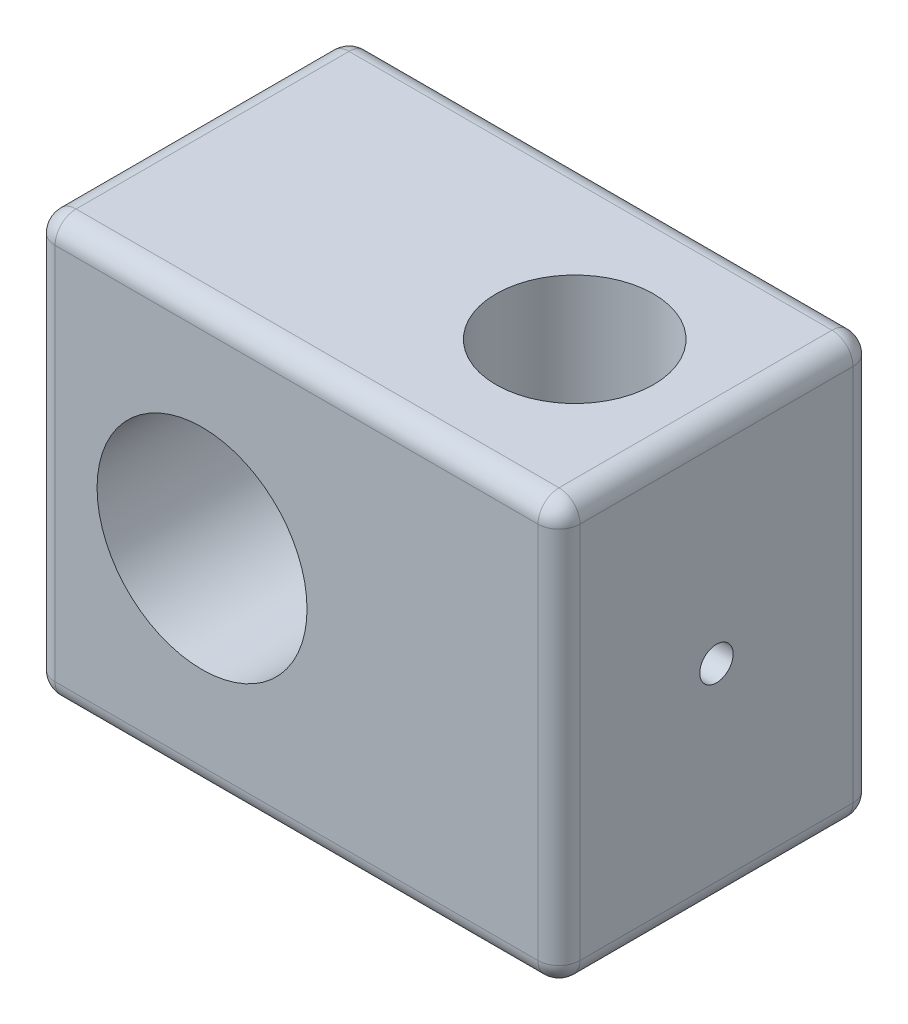
ISO-10303-21;
HEADER;
FILE_DESCRIPTION(('STEP AP214'),'2;1');
FILE_NAME('part.step','',(''),(''),'','','');
FILE_SCHEMA(('AUTOMOTIVE_DESIGN { 1 0 10303 214 1 1 1 1 }'));
ENDSEC;
DATA;
#1=APPLICATION_CONTEXT('core data for automotive mechanical design processes');
#2=APPLICATION_PROTOCOL_DEFINITION('international standard','automotive_design',2000,#1);
#3=PRODUCT_CONTEXT('',#1,'mechanical');
#4=PRODUCT('Part','Part','',(#3));
#5=PRODUCT_RELATED_PRODUCT_CATEGORY('part','',(#4));
#6=PRODUCT_DEFINITION_FORMATION('','',#4);
#7=PRODUCT_DEFINITION_CONTEXT('part definition',#1,'design');
#8=PRODUCT_DEFINITION('design','',#6,#7);
#9=PRODUCT_DEFINITION_SHAPE('','',#8);
#10=(LENGTH_UNIT() NAMED_UNIT(*) SI_UNIT(.MILLI.,.METRE.));
#11=(NAMED_UNIT(*) PLANE_ANGLE_UNIT() SI_UNIT($,.RADIAN.));
#12=(NAMED_UNIT(*) SI_UNIT($,.STERADIAN.) SOLID_ANGLE_UNIT());
#13=UNCERTAINTY_MEASURE_WITH_UNIT(LENGTH_MEASURE(1.E-05),#10,'distance_accuracy_value','');
#14=(GEOMETRIC_REPRESENTATION_CONTEXT(3) GLOBAL_UNCERTAINTY_ASSIGNED_CONTEXT((#13)) GLOBAL_UNIT_ASSIGNED_CONTEXT((#10,
#11,#12)) REPRESENTATION_CONTEXT('',''));
#15=CARTESIAN_POINT('',(0.,0.,0.));
#16=DIRECTION('',(0.,0.,1.));
#17=DIRECTION('',(1.,0.,0.));
#18=AXIS2_PLACEMENT_3D('',#15,#16,#17);
#19=CARTESIAN_POINT('',(31.75,50.8,-19.05));
#20=DIRECTION('',(-1.,0.,0.));
#21=DIRECTION('',(0.,0.,1.));
#22=AXIS2_PLACEMENT_3D('',#19,#20,#21);
#23=PLANE('',#22);
#24=CARTESIAN_POINT('',(31.75,25.4,0.));
#25=DIRECTION('',(1.,0.,0.));
#26=DIRECTION('',(0.,0.,-1.));
#27=AXIS2_PLACEMENT_3D('',#24,#25,#26);
#28=CIRCLE('',#27,2.0193);
#29=CARTESIAN_POINT('',(31.75,25.4,-2.0193));
#30=VERTEX_POINT('',#29);
#31=EDGE_CURVE('E277',#30,#30,#28,.T.);
#32=ORIENTED_EDGE('',*,*,#31,.F.);
#33=EDGE_LOOP('',(#32));
#34=FACE_BOUND('',#33,.T.);
#35=DIRECTION('',(0.,-1.,0.));
#36=VECTOR('',#35,1.);
#37=CARTESIAN_POINT('',(31.75,50.8,16.51));
#38=LINE('',#37,#36);
#39=CARTESIAN_POINT('',(31.75,48.26,16.51));
#40=VERTEX_POINT('',#39);
#41=CARTESIAN_POINT('',(31.75,2.54,16.51));
#42=VERTEX_POINT('',#41);
#43=EDGE_CURVE('E61',#40,#42,#38,.T.);
#44=ORIENTED_EDGE('',*,*,#43,.T.);
#45=DIRECTION('',(0.,0.,-1.));
#46=VECTOR('',#45,1.);
#47=CARTESIAN_POINT('',(31.75,2.54,-19.05));
#48=LINE('',#47,#46);
#49=CARTESIAN_POINT('',(31.75,2.54,-16.51));
#50=VERTEX_POINT('',#49);
#51=EDGE_CURVE('E11',#42,#50,#48,.T.);
#52=ORIENTED_EDGE('',*,*,#51,.T.);
#53=DIRECTION('',(0.,-1.,0.));
#54=VECTOR('',#53,1.);
#55=CARTESIAN_POINT('',(31.75,50.8,-16.51));
#56=LINE('',#55,#54);
#57=CARTESIAN_POINT('',(31.75,48.26,-16.51));
#58=VERTEX_POINT('',#57);
#59=EDGE_CURVE('E50',#50,#58,#56,.F.);
#60=ORIENTED_EDGE('',*,*,#59,.T.);
#61=DIRECTION('',(0.,0.,-1.));
#62=VECTOR('',#61,1.);
#63=CARTESIAN_POINT('',(31.75,48.26,19.05));
#64=LINE('',#63,#62);
#65=EDGE_CURVE('E212',#58,#40,#64,.F.);
#66=ORIENTED_EDGE('',*,*,#65,.T.);
#67=EDGE_LOOP('',(#44,#52,#60,#66));
#68=FACE_BOUND('',#67,.T.);
#69=ADVANCED_FACE('F36',(#34,#68),#23,.F.);
#70=CARTESIAN_POINT('',(-31.75,50.8,-19.05));
#71=DIRECTION('',(0.,0.,1.));
#72=DIRECTION('',(1.,0.,0.));
#73=AXIS2_PLACEMENT_3D('',#70,#71,#72);
#74=PLANE('',#73);
#75=DIRECTION('',(-1.,0.,0.));
#76=VECTOR('',#75,1.);
#77=CARTESIAN_POINT('',(-31.75,2.54,-19.05));
#78=LINE('',#77,#76);
#79=CARTESIAN_POINT('',(29.21,2.54,-19.05));
#80=VERTEX_POINT('',#79);
#81=CARTESIAN_POINT('',(-29.21,2.54,-19.05));
#82=VERTEX_POINT('',#81);
#83=EDGE_CURVE('E182',#80,#82,#78,.T.);
#84=ORIENTED_EDGE('',*,*,#83,.T.);
#85=DIRECTION('',(0.,-1.,0.));
#86=VECTOR('',#85,1.);
#87=CARTESIAN_POINT('',(-29.21,50.8,-19.05));
#88=LINE('',#87,#86);
#89=CARTESIAN_POINT('',(-29.21,48.26,-19.05));
#90=VERTEX_POINT('',#89);
#91=EDGE_CURVE('E184',#82,#90,#88,.F.);
#92=ORIENTED_EDGE('',*,*,#91,.T.);
#93=DIRECTION('',(-1.,0.,0.));
#94=VECTOR('',#93,1.);
#95=CARTESIAN_POINT('',(31.75,48.26,-19.05));
#96=LINE('',#95,#94);
#97=CARTESIAN_POINT('',(29.21,48.26,-19.05));
#98=VERTEX_POINT('',#97);
#99=EDGE_CURVE('E180',#90,#98,#96,.F.);
#100=ORIENTED_EDGE('',*,*,#99,.T.);
#101=DIRECTION('',(0.,-1.,0.));
#102=VECTOR('',#101,1.);
#103=CARTESIAN_POINT('',(29.21,50.8,-19.05));
#104=LINE('',#103,#102);
#105=EDGE_CURVE('E178',#98,#80,#104,.T.);
#106=ORIENTED_EDGE('',*,*,#105,.T.);
#107=EDGE_LOOP('',(#84,#92,#100,#106));
#108=FACE_BOUND('',#107,.T.);
#109=CARTESIAN_POINT('',(-11.43,25.4,-19.05));
#110=DIRECTION('',(0.,0.,1.));
#111=DIRECTION('',(1.,0.,0.));
#112=AXIS2_PLACEMENT_3D('',#109,#110,#111);
#113=CIRCLE('',#112,12.7);
#114=CARTESIAN_POINT('',(1.26999999999999,25.4,-19.05));
#115=VERTEX_POINT('',#114);
#116=EDGE_CURVE('E168',#115,#115,#113,.T.);
#117=ORIENTED_EDGE('',*,*,#116,.T.);
#118=EDGE_LOOP('',(#117));
#119=FACE_BOUND('',#118,.T.);
#120=ADVANCED_FACE('F294',(#108,#119),#74,.F.);
#121=CARTESIAN_POINT('',(-31.75,50.8,-19.05));
#122=DIRECTION('',(1.,0.,0.));
#123=DIRECTION('',(0.,0.,-1.));
#124=AXIS2_PLACEMENT_3D('',#121,#122,#123);
#125=PLANE('',#124);
#126=CARTESIAN_POINT('',(-31.75,25.4,0.));
#127=DIRECTION('',(-1.,0.,0.));
#128=DIRECTION('',(0.,0.,1.));
#129=AXIS2_PLACEMENT_3D('',#126,#127,#128);
#130=CIRCLE('',#129,2.0193);
#131=CARTESIAN_POINT('',(-31.75,25.4,2.0193));
#132=VERTEX_POINT('',#131);
#133=EDGE_CURVE('E440',#132,#132,#130,.T.);
#134=ORIENTED_EDGE('',*,*,#133,.F.);
#135=EDGE_LOOP('',(#134));
#136=FACE_BOUND('',#135,.T.);
#137=DIRECTION('',(0.,-1.,0.));
#138=VECTOR('',#137,1.);
#139=CARTESIAN_POINT('',(-31.75,50.8,-16.51));
#140=LINE('',#139,#138);
#141=CARTESIAN_POINT('',(-31.75,48.26,-16.51));
#142=VERTEX_POINT('',#141);
#143=CARTESIAN_POINT('',(-31.75,2.54,-16.51));
#144=VERTEX_POINT('',#143);
#145=EDGE_CURVE('E141',#142,#144,#140,.T.);
#146=ORIENTED_EDGE('',*,*,#145,.T.);
#147=DIRECTION('',(0.,0.,1.));
#148=VECTOR('',#147,1.);
#149=CARTESIAN_POINT('',(-31.75,2.54,-19.05));
#150=LINE('',#149,#148);
#151=CARTESIAN_POINT('',(-31.75,2.54,16.51));
#152=VERTEX_POINT('',#151);
#153=EDGE_CURVE('E137',#144,#152,#150,.T.);
#154=ORIENTED_EDGE('',*,*,#153,.T.);
#155=DIRECTION('',(0.,-1.,0.));
#156=VECTOR('',#155,1.);
#157=CARTESIAN_POINT('',(-31.75,50.8,16.51));
#158=LINE('',#157,#156);
#159=CARTESIAN_POINT('',(-31.75,48.26,16.51));
#160=VERTEX_POINT('',#159);
#161=EDGE_CURVE('E129',#152,#160,#158,.F.);
#162=ORIENTED_EDGE('',*,*,#161,.T.);
#163=DIRECTION('',(0.,0.,1.));
#164=VECTOR('',#163,1.);
#165=CARTESIAN_POINT('',(-31.75,48.26,-19.05));
#166=LINE('',#165,#164);
#167=EDGE_CURVE('E134',#160,#142,#166,.F.);
#168=ORIENTED_EDGE('',*,*,#167,.T.);
#169=EDGE_LOOP('',(#146,#154,#162,#168));
#170=FACE_BOUND('',#169,.T.);
#171=ADVANCED_FACE('F132',(#136,#170),#125,.F.);
#172=CARTESIAN_POINT('',(-31.75,50.8,19.05));
#173=DIRECTION('',(0.,0.,-1.));
#174=DIRECTION('',(-1.,0.,0.));
#175=AXIS2_PLACEMENT_3D('',#172,#173,#174);
#176=PLANE('',#175);
#177=DIRECTION('',(1.,0.,0.));
#178=VECTOR('',#177,1.);
#179=CARTESIAN_POINT('',(-31.75,48.26,19.05));
#180=LINE('',#179,#178);
#181=CARTESIAN_POINT('',(29.21,48.26,19.05));
#182=VERTEX_POINT('',#181);
#183=CARTESIAN_POINT('',(-29.21,48.26,19.05));
#184=VERTEX_POINT('',#183);
#185=EDGE_CURVE('E189',#182,#184,#180,.F.);
#186=ORIENTED_EDGE('',*,*,#185,.T.);
#187=DIRECTION('',(0.,-1.,0.));
#188=VECTOR('',#187,1.);
#189=CARTESIAN_POINT('',(-29.21,50.8,19.05));
#190=LINE('',#189,#188);
#191=CARTESIAN_POINT('',(-29.21,2.54,19.05));
#192=VERTEX_POINT('',#191);
#193=EDGE_CURVE('E149',#184,#192,#190,.T.);
#194=ORIENTED_EDGE('',*,*,#193,.T.);
#195=DIRECTION('',(1.,0.,0.));
#196=VECTOR('',#195,1.);
#197=CARTESIAN_POINT('',(-31.75,2.54,19.05));
#198=LINE('',#197,#196);
#199=CARTESIAN_POINT('',(29.21,2.54,19.05));
#200=VERTEX_POINT('',#199);
#201=EDGE_CURVE('E191',#192,#200,#198,.T.);
#202=ORIENTED_EDGE('',*,*,#201,.T.);
#203=DIRECTION('',(0.,-1.,0.));
#204=VECTOR('',#203,1.);
#205=CARTESIAN_POINT('',(29.21,50.8,19.05));
#206=LINE('',#205,#204);
#207=EDGE_CURVE('E187',#200,#182,#206,.F.);
#208=ORIENTED_EDGE('',*,*,#207,.T.);
#209=EDGE_LOOP('',(#186,#194,#202,#208));
#210=FACE_BOUND('',#209,.T.);
#211=CARTESIAN_POINT('',(-11.43,25.4,19.05));
#212=DIRECTION('',(0.,0.,1.));
#213=DIRECTION('',(1.,0.,0.));
#214=AXIS2_PLACEMENT_3D('',#211,#212,#213);
#215=CIRCLE('',#214,12.7);
#216=CARTESIAN_POINT('',(1.26999999999999,25.4,19.05));
#217=VERTEX_POINT('',#216);
#218=EDGE_CURVE('E171',#217,#217,#215,.T.);
#219=ORIENTED_EDGE('',*,*,#218,.F.);
#220=EDGE_LOOP('',(#219));
#221=FACE_BOUND('',#220,.T.);
#222=ADVANCED_FACE('F382',(#210,#221),#176,.F.);
#223=CARTESIAN_POINT('',(0.,50.8,0.));
#224=DIRECTION('',(0.,1.,0.));
#225=DIRECTION('',(0.,0.,1.));
#226=AXIS2_PLACEMENT_3D('',#223,#224,#225);
#227=PLANE('',#226);
#228=DIRECTION('',(-1.,0.,0.));
#229=VECTOR('',#228,1.);
#230=CARTESIAN_POINT('',(-31.75,50.8,-16.51));
#231=LINE('',#230,#229);
#232=CARTESIAN_POINT('',(29.21,50.8,-16.51));
#233=VERTEX_POINT('',#232);
#234=CARTESIAN_POINT('',(-29.21,50.8,-16.51));
#235=VERTEX_POINT('',#234);
#236=EDGE_CURVE('E207',#233,#235,#231,.T.);
#237=ORIENTED_EDGE('',*,*,#236,.T.);
#238=DIRECTION('',(0.,0.,1.));
#239=VECTOR('',#238,1.);
#240=CARTESIAN_POINT('',(-29.21,50.8,19.05));
#241=LINE('',#240,#239);
#242=CARTESIAN_POINT('',(-29.21,50.8,16.51));
#243=VERTEX_POINT('',#242);
#244=EDGE_CURVE('E209',#235,#243,#241,.T.);
#245=ORIENTED_EDGE('',*,*,#244,.T.);
#246=DIRECTION('',(1.,0.,0.));
#247=VECTOR('',#246,1.);
#248=CARTESIAN_POINT('',(31.75,50.8,16.51));
#249=LINE('',#248,#247);
#250=CARTESIAN_POINT('',(29.21,50.8,16.51));
#251=VERTEX_POINT('',#250);
#252=EDGE_CURVE('E205',#243,#251,#249,.T.);
#253=ORIENTED_EDGE('',*,*,#252,.T.);
#254=DIRECTION('',(0.,0.,-1.));
#255=VECTOR('',#254,1.);
#256=CARTESIAN_POINT('',(29.21,50.8,-19.05));
#257=LINE('',#256,#255);
#258=EDGE_CURVE('E203',#251,#233,#257,.T.);
#259=ORIENTED_EDGE('',*,*,#258,.T.);
#260=EDGE_LOOP('',(#237,#245,#253,#259));
#261=FACE_BOUND('',#260,.T.);
#262=CARTESIAN_POINT('',(14.605,50.8,0.));
#263=DIRECTION('',(0.,1.,0.));
#264=DIRECTION('',(0.,0.,1.));
#265=AXIS2_PLACEMENT_3D('',#262,#263,#264);
#266=CIRCLE('',#265,9.525);
#267=CARTESIAN_POINT('',(14.605,50.8,9.525));
#268=VERTEX_POINT('',#267);
#269=EDGE_CURVE('E270',#268,#268,#266,.T.);
#270=ORIENTED_EDGE('',*,*,#269,.F.);
#271=EDGE_LOOP('',(#270));
#272=FACE_BOUND('',#271,.T.);
#273=ADVANCED_FACE('F400',(#261,#272),#227,.T.);
#274=CARTESIAN_POINT('',(0.,0.,0.));
#275=DIRECTION('',(0.,1.,0.));
#276=DIRECTION('',(0.,0.,1.));
#277=AXIS2_PLACEMENT_3D('',#274,#275,#276);
#278=PLANE('',#277);
#279=DIRECTION('',(1.,0.,0.));
#280=VECTOR('',#279,1.);
#281=CARTESIAN_POINT('',(0.,0.,16.51));
#282=LINE('',#281,#280);
#283=CARTESIAN_POINT('',(29.21,0.,16.51));
#284=VERTEX_POINT('',#283);
#285=CARTESIAN_POINT('',(-29.21,0.,16.51));
#286=VERTEX_POINT('',#285);
#287=EDGE_CURVE('E198',#284,#286,#282,.F.);
#288=ORIENTED_EDGE('',*,*,#287,.T.);
#289=DIRECTION('',(0.,0.,1.));
#290=VECTOR('',#289,1.);
#291=CARTESIAN_POINT('',(-29.21,0.,0.));
#292=LINE('',#291,#290);
#293=CARTESIAN_POINT('',(-29.21,0.,-16.51));
#294=VERTEX_POINT('',#293);
#295=EDGE_CURVE('E201',#286,#294,#292,.F.);
#296=ORIENTED_EDGE('',*,*,#295,.T.);
#297=DIRECTION('',(-1.,0.,0.));
#298=VECTOR('',#297,1.);
#299=CARTESIAN_POINT('',(0.,0.,-16.51));
#300=LINE('',#299,#298);
#301=CARTESIAN_POINT('',(29.21,0.,-16.51));
#302=VERTEX_POINT('',#301);
#303=EDGE_CURVE('E196',#294,#302,#300,.F.);
#304=ORIENTED_EDGE('',*,*,#303,.T.);
#305=DIRECTION('',(0.,0.,-1.));
#306=VECTOR('',#305,1.);
#307=CARTESIAN_POINT('',(29.21,0.,0.));
#308=LINE('',#307,#306);
#309=EDGE_CURVE('E194',#302,#284,#308,.F.);
#310=ORIENTED_EDGE('',*,*,#309,.T.);
#311=EDGE_LOOP('',(#288,#296,#304,#310));
#312=FACE_BOUND('',#311,.T.);
#313=CARTESIAN_POINT('',(14.605,0.,0.));
#314=DIRECTION('',(0.,1.,0.));
#315=DIRECTION('',(0.,0.,1.));
#316=AXIS2_PLACEMENT_3D('',#313,#314,#315);
#317=CIRCLE('',#316,9.525);
#318=CARTESIAN_POINT('',(14.605,0.,9.525));
#319=VERTEX_POINT('',#318);
#320=EDGE_CURVE('E174',#319,#319,#317,.T.);
#321=ORIENTED_EDGE('',*,*,#320,.T.);
#322=EDGE_LOOP('',(#321));
#323=FACE_BOUND('',#322,.T.);
#324=ADVANCED_FACE('F413',(#312,#323),#278,.F.);
#325=CARTESIAN_POINT('',(-11.43,25.4,-44.45));
#326=DIRECTION('',(0.,0.,1.));
#327=DIRECTION('',(1.,0.,0.));
#328=AXIS2_PLACEMENT_3D('',#325,#326,#327);
#329=CYLINDRICAL_SURFACE('',#328,12.7);
#330=CARTESIAN_POINT('',(-24.13,25.4,2.01929999999999));
#331=CARTESIAN_POINT('',(-24.1299981234223,25.5126632562707,2.01929541943338));
#332=CARTESIAN_POINT('',(-24.128485164548,25.6253898394267,2.00983938839292));
#333=CARTESIAN_POINT('',(-24.1225953236855,25.8476864574412,1.97227792442321));
#334=CARTESIAN_POINT('',(-24.1182157348926,25.9572534066346,1.94415486486768));
#335=CARTESIAN_POINT('',(-24.1070843069194,26.1699819871683,1.87012569415471));
#336=CARTESIAN_POINT('',(-24.1003343391707,26.2731485962368,1.82423360884987));
#337=CARTESIAN_POINT('',(-24.0852060736359,26.4703026627664,1.71600468302943));
#338=CARTESIAN_POINT('',(-24.0768279809047,26.5642912739169,1.6536699130418));
#339=CARTESIAN_POINT('',(-24.0592917716548,26.74125675571,1.51374540385086));
#340=CARTESIAN_POINT('',(-24.0501280707508,26.8241418257641,1.43604025004347));
#341=CARTESIAN_POINT('',(-24.0320966479557,26.9757548809106,1.26782914572906));
#342=CARTESIAN_POINT('',(-24.0232289439731,27.0444820107084,1.17732242242382));
#343=CARTESIAN_POINT('',(-24.0067394347969,27.1661912489787,0.985453168517452));
#344=CARTESIAN_POINT('',(-23.9991248467985,27.2190834957233,0.884032961314006));
#345=CARTESIAN_POINT('',(-23.9860806433762,27.3070470834498,0.67360655641907));
#346=CARTESIAN_POINT('',(-23.9806508939245,27.3421195176135,0.564600824539019));
#347=CARTESIAN_POINT('',(-23.9726464258384,27.3931605936439,0.343067245676914));
#348=CARTESIAN_POINT('',(-23.970048125765,27.4092871141053,0.230576641632938));
#349=CARTESIAN_POINT('',(-23.9679292953562,27.4224679007121,0.00445837852565597));
#350=CARTESIAN_POINT('',(-23.9684085667,27.4195233958072,-0.109169206798668));
#351=CARTESIAN_POINT('',(-23.9723691809031,27.3947745121742,-0.333214513899402));
#352=CARTESIAN_POINT('',(-23.9758224065473,27.373146768042,-0.443652316435046));
#353=CARTESIAN_POINT('',(-23.9852978684867,27.3119222093195,-0.659311418789963));
#354=CARTESIAN_POINT('',(-23.9913201856306,27.2723248292258,-0.764532554325436));
#355=CARTESIAN_POINT('',(-24.0052859651365,27.1761037586553,-0.967304345600591));
#356=CARTESIAN_POINT('',(-24.0132377518594,27.1194060269148,-1.06481926975695));
#357=CARTESIAN_POINT('',(-24.030160615939,26.9906463375358,-1.24901808513279));
#358=CARTESIAN_POINT('',(-24.0391317682919,26.9185832491043,-1.33570117845303));
#359=CARTESIAN_POINT('',(-24.0572064140492,26.7601726643132,-1.4967987642301));
#360=CARTESIAN_POINT('',(-24.0663102602134,26.6736734677584,-1.571064128113));
#361=CARTESIAN_POINT('',(-24.083530944053,26.4893609940163,-1.70404779248871));
#362=CARTESIAN_POINT('',(-24.0916477763835,26.3915476555654,-1.76276600879146));
#363=CARTESIAN_POINT('',(-24.1059899292325,26.1872484221442,-1.86299935574656));
#364=CARTESIAN_POINT('',(-24.1122138871297,26.0807563492175,-1.90450210130166));
#365=CARTESIAN_POINT('',(-24.1220578799677,25.8621925967703,-1.96899214384885));
#366=CARTESIAN_POINT('',(-24.1256781129397,25.7501213422786,-1.99198084897779));
#367=CARTESIAN_POINT('',(-24.1298803151556,25.5248666847069,-2.01858990991501));
#368=CARTESIAN_POINT('',(-24.130494419128,25.4117080598497,-2.02241512874635));
#369=CARTESIAN_POINT('',(-24.128702929497,25.1863660981908,-2.01113367031409));
#370=CARTESIAN_POINT('',(-24.1262974413078,25.0741827274806,-1.99602765394114));
#371=CARTESIAN_POINT('',(-24.1187569315529,24.8546027440811,-1.94748291000632));
#372=CARTESIAN_POINT('',(-24.1136369019296,24.7471833181194,-1.91414484334637));
#373=CARTESIAN_POINT('',(-24.1012392910446,24.5394584155008,-1.83018910513622));
#374=CARTESIAN_POINT('',(-24.0939615978283,24.4391533083189,-1.77957053693283));
#375=CARTESIAN_POINT('',(-24.0779768592489,24.2476092838119,-1.66201608019022));
#376=CARTESIAN_POINT('',(-24.0692587086759,24.1564504239713,-1.59495128398503));
#377=CARTESIAN_POINT('',(-24.0513957110608,23.9866080460781,-1.44658643017066));
#378=CARTESIAN_POINT('',(-24.0422508360004,23.9079253486906,-1.36528543686324));
#379=CARTESIAN_POINT('',(-24.0244621113867,23.7645160014592,-1.18984038098879));
#380=CARTESIAN_POINT('',(-24.015823769477,23.699927260612,-1.0955829461414));
#381=CARTESIAN_POINT('',(-24.0001265119102,23.5875002557366,-0.897435996861891));
#382=CARTESIAN_POINT('',(-23.9930675495659,23.5396614965465,-0.793546767279143));
#383=CARTESIAN_POINT('',(-23.9813689444812,23.4623022310423,-0.57948296177424));
#384=CARTESIAN_POINT('',(-23.9767200021568,23.4327112266959,-0.469334393654317));
#385=CARTESIAN_POINT('',(-23.970343814378,23.3924643625982,-0.245550816994673));
#386=CARTESIAN_POINT('',(-23.9686163398188,23.3818070180453,-0.131916082555572));
#387=CARTESIAN_POINT('',(-23.9682879360717,23.379768540033,0.0942382784805937));
#388=CARTESIAN_POINT('',(-23.9696518170675,23.3881704503214,0.206755957845291));
#389=CARTESIAN_POINT('',(-23.9752756313505,23.4235448390905,0.428755668558595));
#390=CARTESIAN_POINT('',(-23.9795355575942,23.4505172724053,0.538237707289587));
#391=CARTESIAN_POINT('',(-23.9904586065733,23.522186933353,0.750985652832729));
#392=CARTESIAN_POINT('',(-23.9971194204742,23.5668671362498,0.85425742085264));
#393=CARTESIAN_POINT('',(-24.0120962328879,23.6726621032144,1.05187424393756));
#394=CARTESIAN_POINT('',(-24.0204123012837,23.7337775611992,1.14621892186223));
#395=CARTESIAN_POINT('',(-24.0378749286258,23.8714891251157,1.32440255452851));
#396=CARTESIAN_POINT('',(-24.0470294902824,23.9482453674813,1.40811697759306));
#397=CARTESIAN_POINT('',(-24.0650723869138,24.1147214253734,1.56155290020761));
#398=CARTESIAN_POINT('',(-24.0739606597748,24.2044442374605,1.63127115633617));
#399=CARTESIAN_POINT('',(-24.0905333112229,24.3949683124223,1.75512890473203));
#400=CARTESIAN_POINT('',(-24.0982098414048,24.495835135616,1.80916859574557));
#401=CARTESIAN_POINT('',(-24.1114174994918,24.7052922079402,1.899455978028));
#402=CARTESIAN_POINT('',(-24.1169508033621,24.8138744904602,1.9357217247297));
#403=CARTESIAN_POINT('',(-24.1240146906305,25.0024251516279,1.98139141037461));
#404=CARTESIAN_POINT('',(-24.1262474079058,25.0812415472425,1.99558486084359));
#405=CARTESIAN_POINT('',(-24.1292407179407,25.2400279960314,2.01454071197954));
#406=CARTESIAN_POINT('',(-24.1300013325543,25.3199980320617,2.0193032526518));
#407=CARTESIAN_POINT('',(-24.13,25.4,2.01929999999999));
#408=B_SPLINE_CURVE_WITH_KNOTS('',3,(#330,#331,#332,#333,#334,#335,#336,#337,#338,#339,#340,
#341,#342,#343,#344,#345,#346,#347,#348,#349,#350,#351,#352,#353,#354,#355,#356,#357,#358,#359,
#360,#361,#362,#363,#364,#365,#366,#367,#368,#369,#370,#371,#372,#373,#374,#375,#376,#377,#378,
#379,#380,#381,#382,#383,#384,#385,#386,#387,#388,#389,#390,#391,#392,#393,#394,#395,#396,#397,
#398,#399,#400,#401,#402,#403,#404,#405,#406,#407),.UNSPECIFIED.,.T.,.F.,(4,2,2,2,2,2,2,2,2,2,2,
2,2,2,2,2,2,2,2,2,2,2,2,2,2,2,2,2,2,2,2,2,2,2,2,2,2,2,4),(0.,0.337697383615409,
0.675714097629314,1.01346454273211,1.35117247724794,1.69151969545845,2.03188746834164,
2.37415170211911,2.71639493667075,3.05576551942244,3.39511423312218,3.73128936608757,
4.06747507919782,4.40513783453971,4.74282544830487,5.0843152770617,5.42580695499763,
5.767543883439,6.10925481767238,6.44730485290051,6.78534308710887,7.12153354991228,
7.45774145966739,7.79667392167661,8.13562866896561,8.47776453418903,8.81989028435897,
9.16068585301008,9.50145469485979,9.83836397106466,10.1752724278669,10.5118577543552,
10.8484572941295,11.1886938666126,11.5290091935132,11.8714455039933,12.2135332301957,
12.4533350718004,12.6931333534331),.UNSPECIFIED.);
#409=CARTESIAN_POINT('',(-24.13,25.4,2.01929999999999));
#410=VERTEX_POINT('',#409);
#411=EDGE_CURVE('E40',#410,#410,#408,.T.);
#412=ORIENTED_EDGE('',*,*,#411,.T.);
#413=EDGE_LOOP('',(#412));
#414=FACE_BOUND('',#413,.T.);
#415=ORIENTED_EDGE('',*,*,#218,.T.);
#416=EDGE_LOOP('',(#415));
#417=FACE_BOUND('',#416,.T.);
#418=ORIENTED_EDGE('',*,*,#116,.F.);
#419=EDGE_LOOP('',(#418));
#420=FACE_BOUND('',#419,.T.);
#421=ADVANCED_FACE('F419',(#414,#417,#420),#329,.F.);
#422=CARTESIAN_POINT('',(14.605,-12.7,0.));
#423=DIRECTION('',(0.,1.,0.));
#424=DIRECTION('',(0.,0.,1.));
#425=AXIS2_PLACEMENT_3D('',#422,#423,#424);
#426=CYLINDRICAL_SURFACE('',#425,9.525);
#427=CARTESIAN_POINT('',(23.9134935682419,25.4,-2.0193));
#428=CARTESIAN_POINT('',(23.9134958276222,25.5120488871793,-2.0192960342854));
#429=CARTESIAN_POINT('',(23.9155387344406,25.6241462640675,-2.0099420795579));
#430=CARTESIAN_POINT('',(23.9234757318222,25.8451593369637,-1.97281073672892));
#431=CARTESIAN_POINT('',(23.9293727160317,25.9540725780779,-1.94501950565945));
#432=CARTESIAN_POINT('',(23.9443206678381,26.1654882137549,-1.87192289554964));
#433=CARTESIAN_POINT('',(23.953368293539,26.2679972659192,-1.82663606859986));
#434=CARTESIAN_POINT('',(23.9735940860811,26.4639630538675,-1.71988607041654));
#435=CARTESIAN_POINT('',(23.9847721815408,26.5574200927818,-1.65842344112805));
#436=CARTESIAN_POINT('',(24.0081976859852,26.7341153560852,-1.52002642668887));
#437=CARTESIAN_POINT('',(24.0204580650156,26.8171889473387,-1.44288400993213));
#438=CARTESIAN_POINT('',(24.0445529318884,26.9693189884405,-1.27576644750205));
#439=CARTESIAN_POINT('',(24.0563873877995,27.0383743891441,-1.1857903421915));
#440=CARTESIAN_POINT('',(24.0784377416433,27.1611545084111,-0.994460657698382));
#441=CARTESIAN_POINT('',(24.0886365546593,27.2147215747058,-0.893003771685997));
#442=CARTESIAN_POINT('',(24.1061202831368,27.3039854781439,-0.682276462386102));
#443=CARTESIAN_POINT('',(24.1134055054546,27.3396841972619,-0.573006863354682));
#444=CARTESIAN_POINT('',(24.1241495595113,27.391682195543,-0.351466558125549));
#445=CARTESIAN_POINT('',(24.1276632525701,27.4082598855574,-0.239263903377372));
#446=CARTESIAN_POINT('',(24.1306582062144,27.4224150401105,-0.0136186863599364));
#447=CARTESIAN_POINT('',(24.1301399012929,27.4199945519166,0.0998237409942616));
#448=CARTESIAN_POINT('',(24.1251714008322,27.3964308199228,0.322811288401547));
#449=CARTESIAN_POINT('',(24.1207842131528,27.3755875928472,0.432389721727887));
#450=CARTESIAN_POINT('',(24.1086424073607,27.3162473125869,0.646457361508988));
#451=CARTESIAN_POINT('',(24.1008876431987,27.2777494937324,0.750946347019759));
#452=CARTESIAN_POINT('',(24.0827797527982,27.1839228545574,0.952710363289563));
#453=CARTESIAN_POINT('',(24.0724089409668,27.1284789081691,1.04993020458665));
#454=CARTESIAN_POINT('',(24.0502083817416,27.0024194616183,1.23379613870029));
#455=CARTESIAN_POINT('',(24.0383784469836,26.9318020121796,1.32044087073238));
#456=CARTESIAN_POINT('',(24.0142895533202,26.7757620939969,1.48248003664453));
#457=CARTESIAN_POINT('',(24.0020267288121,26.6900770382119,1.55762124230271));
#458=CARTESIAN_POINT('',(23.9786719452299,26.5071961345318,1.69251280035529));
#459=CARTESIAN_POINT('',(23.9675800141377,26.410000011665,1.75226278498212));
#460=CARTESIAN_POINT('',(23.9478135907654,26.2064635473824,1.85477896359418));
#461=CARTESIAN_POINT('',(23.9391455663883,26.1000997128169,1.89749984414542));
#462=CARTESIAN_POINT('',(23.9252997947002,25.8814762102576,1.96438678020417));
#463=CARTESIAN_POINT('',(23.9201215306094,25.7692174178715,1.98855558306294));
#464=CARTESIAN_POINT('',(23.9139463087039,25.544297558601,2.01726482073516));
#465=CARTESIAN_POINT('',(23.9128710548372,25.4316855084357,2.02217285322548));
#466=CARTESIAN_POINT('',(23.9148127743281,25.2072521484623,2.01321422632782));
#467=CARTESIAN_POINT('',(23.9178294848494,25.0954307883302,1.99934877280375));
#468=CARTESIAN_POINT('',(23.9275415152272,24.8770165264781,1.95355496592537));
#469=CARTESIAN_POINT('',(23.9341960347802,24.7703796638561,1.92182683788693));
#470=CARTESIAN_POINT('',(23.9503974613022,24.5639354482086,1.84142411970356));
#471=CARTESIAN_POINT('',(23.9599446311425,24.4641287168861,1.79274798933916));
#472=CARTESIAN_POINT('',(23.9810290842012,24.27258057609,1.67901294856148));
#473=CARTESIAN_POINT('',(23.9925932680125,24.1809774260864,1.61372627419029));
#474=CARTESIAN_POINT('',(24.0163367699996,24.0098923484838,1.46892346708494));
#475=CARTESIAN_POINT('',(24.0285161595988,23.9304118326089,1.38940567942673));
#476=CARTESIAN_POINT('',(24.0523743933812,23.784413585957,1.21673926782412));
#477=CARTESIAN_POINT('',(24.0640408262646,23.7181457157686,1.12337737321942));
#478=CARTESIAN_POINT('',(24.0853350490598,23.6022352674056,0.926632738448491));
#479=CARTESIAN_POINT('',(24.0949629309117,23.5525919393933,0.823250450515927));
#480=CARTESIAN_POINT('',(24.1110426654255,23.4716937534398,0.610022710789859));
#481=CARTESIAN_POINT('',(24.1175138701518,23.4403266163067,0.500221382630653));
#482=CARTESIAN_POINT('',(24.1266345531886,23.3965185597381,0.276755967382603));
#483=CARTESIAN_POINT('',(24.1292845517008,23.3840750641106,0.163092408237336));
#484=CARTESIAN_POINT('',(24.1304499524258,23.3785774490569,-0.0624937077791557));
#485=CARTESIAN_POINT('',(24.129045105945,23.3851493384593,-0.174406903791918));
#486=CARTESIAN_POINT('',(24.1224283560191,23.4166633769963,-0.395495191065124));
#487=CARTESIAN_POINT('',(24.1172165131122,23.4416052340144,-0.504670325837252));
#488=CARTESIAN_POINT('',(24.1035759430616,23.5089766505189,-0.716914800080718));
#489=CARTESIAN_POINT('',(24.0951564321222,23.551356136233,-0.820000664006821));
#490=CARTESIAN_POINT('',(24.0760023154759,23.6523497981314,-1.01764972549338));
#491=CARTESIAN_POINT('',(24.0652675000252,23.7109654452892,-1.11221214981276));
#492=CARTESIAN_POINT('',(24.042415996368,23.8440025893657,-1.29196368715436));
#493=CARTESIAN_POINT('',(24.0302779706593,23.9186888006591,-1.37695418769736));
#494=CARTESIAN_POINT('',(24.0061072560392,24.0812092981342,-1.53332402984869));
#495=CARTESIAN_POINT('',(23.9940745930272,24.1690467260553,-1.60470010977078));
#496=CARTESIAN_POINT('',(23.9713115330889,24.3566842162064,-1.73266295139833));
#497=CARTESIAN_POINT('',(23.9605991195638,24.4566190184914,-1.78905550430521));
#498=CARTESIAN_POINT('',(23.9419130547124,24.6647501667809,-1.88415679283499));
#499=CARTESIAN_POINT('',(23.9339370249865,24.7729392378643,-1.92288089516453));
#500=CARTESIAN_POINT('',(23.9231451538388,24.9677417035187,-1.97441124192763));
#501=CARTESIAN_POINT('',(23.9195492349054,25.0532774161559,-1.99121305590853));
#502=CARTESIAN_POINT('',(23.9147226150809,25.2258657002096,-2.01365873565123));
#503=CARTESIAN_POINT('',(23.9134918123039,25.3129182061216,-2.01930308206133));
#504=CARTESIAN_POINT('',(23.9134935682419,25.4,-2.0193));
#505=B_SPLINE_CURVE_WITH_KNOTS('',3,(#427,#428,#429,#430,#431,#432,#433,#434,#435,#436,#437,
#438,#439,#440,#441,#442,#443,#444,#445,#446,#447,#448,#449,#450,#451,#452,#453,#454,#455,#456,
#457,#458,#459,#460,#461,#462,#463,#464,#465,#466,#467,#468,#469,#470,#471,#472,#473,#474,#475,
#476,#477,#478,#479,#480,#481,#482,#483,#484,#485,#486,#487,#488,#489,#490,#491,#492,#493,#494,
#495,#496,#497,#498,#499,#500,#501,#502,#503,#504),.UNSPECIFIED.,.T.,.F.,(4,2,2,2,2,2,2,2,2,2,2,
2,2,2,2,2,2,2,2,2,2,2,2,2,2,2,2,2,2,2,2,2,2,2,2,2,2,2,4),(0.,0.335827627248182,
0.671907684423252,1.00763234076363,1.34334575060442,1.68384405138854,2.02436782624427,
2.36824464067148,2.71208522882156,3.05085349706793,3.38958525972483,3.72290032328511,
4.05622984390347,4.39187621227835,4.72756572554059,5.06982184549913,5.41208614278362,
5.75525520080122,6.09837342958305,6.43491034592719,6.77142564676183,7.10424192303306,
7.43708845325124,7.77477121491845,8.11249327097291,8.45609694251384,8.79968511397852,
9.14113957886817,9.48254755529556,9.81728669858146,10.1520205190117,10.4857997551024,
10.8196092410233,11.1594078172662,11.4992876990689,11.8433789400329,12.1871703428391,
12.4481790225692,12.7091764581608),.UNSPECIFIED.);
#506=CARTESIAN_POINT('',(23.9134935682419,25.4,-2.0193));
#507=VERTEX_POINT('',#506);
#508=EDGE_CURVE('E219',#507,#507,#505,.T.);
#509=ORIENTED_EDGE('',*,*,#508,.T.);
#510=EDGE_LOOP('',(#509));
#511=FACE_BOUND('',#510,.T.);
#512=ORIENTED_EDGE('',*,*,#269,.T.);
#513=EDGE_LOOP('',(#512));
#514=FACE_BOUND('',#513,.T.);
#515=ORIENTED_EDGE('',*,*,#320,.F.);
#516=EDGE_LOOP('',(#515));
#517=FACE_BOUND('',#516,.T.);
#518=ADVANCED_FACE('F278',(#511,#514,#517),#426,.F.);
#519=CARTESIAN_POINT('',(29.21,50.8,16.51));
#520=DIRECTION('',(0.,-1.,0.));
#521=DIRECTION('',(0.,0.,-1.));
#522=AXIS2_PLACEMENT_3D('',#519,#520,#521);
#523=CYLINDRICAL_SURFACE('',#522,2.54);
#524=CARTESIAN_POINT('',(29.21,48.26,16.51));
#525=DIRECTION('',(0.,1.,0.));
#526=DIRECTION('',(0.,0.,1.));
#527=AXIS2_PLACEMENT_3D('',#524,#525,#526);
#528=CIRCLE('',#527,2.54);
#529=EDGE_CURVE('E268',#182,#40,#528,.T.);
#530=ORIENTED_EDGE('',*,*,#529,.F.);
#531=ORIENTED_EDGE('',*,*,#207,.F.);
#532=CARTESIAN_POINT('',(29.21,2.54,16.51));
#533=DIRECTION('',(0.,-1.,0.));
#534=DIRECTION('',(0.,0.,-1.));
#535=AXIS2_PLACEMENT_3D('',#532,#533,#534);
#536=CIRCLE('',#535,2.54);
#537=EDGE_CURVE('E265',#42,#200,#536,.T.);
#538=ORIENTED_EDGE('',*,*,#537,.F.);
#539=ORIENTED_EDGE('',*,*,#43,.F.);
#540=EDGE_LOOP('',(#530,#531,#538,#539));
#541=FACE_BOUND('',#540,.T.);
#542=ADVANCED_FACE('F38',(#541),#523,.T.);
#543=CARTESIAN_POINT('',(29.21,48.26,16.51));
#544=DIRECTION('',(0.,0.,1.));
#545=DIRECTION('',(1.,0.,0.));
#546=AXIS2_PLACEMENT_3D('',#543,#544,#545);
#547=SPHERICAL_SURFACE('',#546,2.54);
#548=CARTESIAN_POINT('',(29.21,48.26,16.51));
#549=DIRECTION('',(1.,0.,0.));
#550=DIRECTION('',(0.,0.,-1.));
#551=AXIS2_PLACEMENT_3D('',#548,#549,#550);
#552=CIRCLE('',#551,2.54);
#553=EDGE_CURVE('E259',#182,#251,#552,.F.);
#554=ORIENTED_EDGE('',*,*,#553,.F.);
#555=ORIENTED_EDGE('',*,*,#529,.T.);
#556=CARTESIAN_POINT('',(29.21,48.26,16.51));
#557=DIRECTION('',(0.,0.,1.));
#558=DIRECTION('',(1.,0.,0.));
#559=AXIS2_PLACEMENT_3D('',#556,#557,#558);
#560=CIRCLE('',#559,2.54);
#561=EDGE_CURVE('E262',#251,#40,#560,.F.);
#562=ORIENTED_EDGE('',*,*,#561,.F.);
#563=EDGE_LOOP('',(#554,#555,#562));
#564=FACE_BOUND('',#563,.T.);
#565=ADVANCED_FACE('F368',(#564),#547,.T.);
#566=CARTESIAN_POINT('',(29.21,2.54,16.51));
#567=DIRECTION('',(0.,0.,1.));
#568=DIRECTION('',(1.,0.,0.));
#569=AXIS2_PLACEMENT_3D('',#566,#567,#568);
#570=SPHERICAL_SURFACE('',#569,2.54);
#571=CARTESIAN_POINT('',(29.21,2.54,16.51));
#572=DIRECTION('',(0.,0.,1.));
#573=DIRECTION('',(1.,0.,0.));
#574=AXIS2_PLACEMENT_3D('',#571,#572,#573);
#575=CIRCLE('',#574,2.54);
#576=EDGE_CURVE('E253',#42,#284,#575,.F.);
#577=ORIENTED_EDGE('',*,*,#576,.F.);
#578=ORIENTED_EDGE('',*,*,#537,.T.);
#579=CARTESIAN_POINT('',(29.21,2.54,16.51));
#580=DIRECTION('',(1.,0.,0.));
#581=DIRECTION('',(0.,0.,-1.));
#582=AXIS2_PLACEMENT_3D('',#579,#580,#581);
#583=CIRCLE('',#582,2.54);
#584=EDGE_CURVE('E256',#284,#200,#583,.F.);
#585=ORIENTED_EDGE('',*,*,#584,.F.);
#586=EDGE_LOOP('',(#577,#578,#585));
#587=FACE_BOUND('',#586,.T.);
#588=ADVANCED_FACE('F365',(#587),#570,.T.);
#589=CARTESIAN_POINT('',(29.21,48.26,0.));
#590=DIRECTION('',(0.,0.,1.));
#591=DIRECTION('',(1.,0.,0.));
#592=AXIS2_PLACEMENT_3D('',#589,#590,#591);
#593=CYLINDRICAL_SURFACE('',#592,2.54);
#594=ORIENTED_EDGE('',*,*,#561,.T.);
#595=ORIENTED_EDGE('',*,*,#65,.F.);
#596=CARTESIAN_POINT('',(29.21,48.26,-16.51));
#597=DIRECTION('',(0.,0.,-1.));
#598=DIRECTION('',(-1.,0.,0.));
#599=AXIS2_PLACEMENT_3D('',#596,#597,#598);
#600=CIRCLE('',#599,2.54);
#601=EDGE_CURVE('E248',#233,#58,#600,.T.);
#602=ORIENTED_EDGE('',*,*,#601,.F.);
#603=ORIENTED_EDGE('',*,*,#258,.F.);
#604=EDGE_LOOP('',(#594,#595,#602,#603));
#605=FACE_BOUND('',#604,.T.);
#606=ADVANCED_FACE('F361',(#605),#593,.T.);
#607=CARTESIAN_POINT('',(0.,48.26,16.51));
#608=DIRECTION('',(-1.,0.,0.));
#609=DIRECTION('',(0.,0.,1.));
#610=AXIS2_PLACEMENT_3D('',#607,#608,#609);
#611=CYLINDRICAL_SURFACE('',#610,2.54);
#612=ORIENTED_EDGE('',*,*,#553,.T.);
#613=ORIENTED_EDGE('',*,*,#252,.F.);
#614=CARTESIAN_POINT('',(-29.21,48.26,16.51));
#615=DIRECTION('',(-1.,0.,0.));
#616=DIRECTION('',(0.,0.,1.));
#617=AXIS2_PLACEMENT_3D('',#614,#615,#616);
#618=CIRCLE('',#617,2.54);
#619=EDGE_CURVE('E153',#184,#243,#618,.T.);
#620=ORIENTED_EDGE('',*,*,#619,.F.);
#621=ORIENTED_EDGE('',*,*,#185,.F.);
#622=EDGE_LOOP('',(#612,#613,#620,#621));
#623=FACE_BOUND('',#622,.T.);
#624=ADVANCED_FACE('F358',(#623),#611,.T.);
#625=CARTESIAN_POINT('',(-29.21,50.8,16.51));
#626=DIRECTION('',(0.,-1.,0.));
#627=DIRECTION('',(0.,0.,-1.));
#628=AXIS2_PLACEMENT_3D('',#625,#626,#627);
#629=CYLINDRICAL_SURFACE('',#628,2.54);
#630=CARTESIAN_POINT('',(-29.21,2.54,16.51));
#631=DIRECTION('',(0.,-1.,0.));
#632=DIRECTION('',(0.,0.,-1.));
#633=AXIS2_PLACEMENT_3D('',#630,#631,#632);
#634=CIRCLE('',#633,2.54);
#635=EDGE_CURVE('E154',#192,#152,#634,.T.);
#636=ORIENTED_EDGE('',*,*,#635,.F.);
#637=ORIENTED_EDGE('',*,*,#193,.F.);
#638=CARTESIAN_POINT('',(-29.21,48.26,16.51));
#639=DIRECTION('',(0.,1.,0.));
#640=DIRECTION('',(0.,0.,1.));
#641=AXIS2_PLACEMENT_3D('',#638,#639,#640);
#642=CIRCLE('',#641,2.54);
#643=EDGE_CURVE('E145',#160,#184,#642,.T.);
#644=ORIENTED_EDGE('',*,*,#643,.F.);
#645=ORIENTED_EDGE('',*,*,#161,.F.);
#646=EDGE_LOOP('',(#636,#637,#644,#645));
#647=FACE_BOUND('',#646,.T.);
#648=ADVANCED_FACE('F147',(#647),#629,.T.);
#649=CARTESIAN_POINT('',(-31.75,2.54,16.51));
#650=DIRECTION('',(1.,0.,0.));
#651=DIRECTION('',(0.,0.,-1.));
#652=AXIS2_PLACEMENT_3D('',#649,#650,#651);
#653=CYLINDRICAL_SURFACE('',#652,2.54);
#654=ORIENTED_EDGE('',*,*,#584,.T.);
#655=ORIENTED_EDGE('',*,*,#201,.F.);
#656=CARTESIAN_POINT('',(-29.21,2.54,16.51));
#657=DIRECTION('',(-1.,0.,0.));
#658=DIRECTION('',(0.,0.,1.));
#659=AXIS2_PLACEMENT_3D('',#656,#657,#658);
#660=CIRCLE('',#659,2.54);
#661=EDGE_CURVE('E244',#286,#192,#660,.T.);
#662=ORIENTED_EDGE('',*,*,#661,.F.);
#663=ORIENTED_EDGE('',*,*,#287,.F.);
#664=EDGE_LOOP('',(#654,#655,#662,#663));
#665=FACE_BOUND('',#664,.T.);
#666=ADVANCED_FACE('F351',(#665),#653,.T.);
#667=CARTESIAN_POINT('',(29.21,2.54,-19.05));
#668=DIRECTION('',(0.,0.,-1.));
#669=DIRECTION('',(-1.,0.,0.));
#670=AXIS2_PLACEMENT_3D('',#667,#668,#669);
#671=CYLINDRICAL_SURFACE('',#670,2.54);
#672=ORIENTED_EDGE('',*,*,#576,.T.);
#673=ORIENTED_EDGE('',*,*,#309,.F.);
#674=CARTESIAN_POINT('',(29.21,2.54,-16.51));
#675=DIRECTION('',(0.,0.,-1.));
#676=DIRECTION('',(-1.,0.,0.));
#677=AXIS2_PLACEMENT_3D('',#674,#675,#676);
#678=CIRCLE('',#677,2.54);
#679=EDGE_CURVE('E241',#50,#302,#678,.T.);
#680=ORIENTED_EDGE('',*,*,#679,.F.);
#681=ORIENTED_EDGE('',*,*,#51,.F.);
#682=EDGE_LOOP('',(#672,#673,#680,#681));
#683=FACE_BOUND('',#682,.T.);
#684=ADVANCED_FACE('F347',(#683),#671,.T.);
#685=CARTESIAN_POINT('',(29.21,50.8,-16.51));
#686=DIRECTION('',(0.,-1.,0.));
#687=DIRECTION('',(0.,0.,-1.));
#688=AXIS2_PLACEMENT_3D('',#685,#686,#687);
#689=CYLINDRICAL_SURFACE('',#688,2.54);
#690=CARTESIAN_POINT('',(29.21,48.26,-16.51));
#691=DIRECTION('',(0.,1.,0.));
#692=DIRECTION('',(0.,0.,1.));
#693=AXIS2_PLACEMENT_3D('',#690,#691,#692);
#694=CIRCLE('',#693,2.54);
#695=EDGE_CURVE('E250',#58,#98,#694,.T.);
#696=ORIENTED_EDGE('',*,*,#695,.F.);
#697=ORIENTED_EDGE('',*,*,#59,.F.);
#698=CARTESIAN_POINT('',(29.21,2.54,-16.51));
#699=DIRECTION('',(0.,-1.,0.));
#700=DIRECTION('',(0.,0.,-1.));
#701=AXIS2_PLACEMENT_3D('',#698,#699,#700);
#702=CIRCLE('',#701,2.54);
#703=EDGE_CURVE('E238',#80,#50,#702,.T.);
#704=ORIENTED_EDGE('',*,*,#703,.F.);
#705=ORIENTED_EDGE('',*,*,#105,.F.);
#706=EDGE_LOOP('',(#696,#697,#704,#705));
#707=FACE_BOUND('',#706,.T.);
#708=ADVANCED_FACE('F343',(#707),#689,.T.);
#709=CARTESIAN_POINT('',(29.21,48.26,-16.51));
#710=DIRECTION('',(0.,0.,1.));
#711=DIRECTION('',(1.,0.,0.));
#712=AXIS2_PLACEMENT_3D('',#709,#710,#711);
#713=SPHERICAL_SURFACE('',#712,2.54);
#714=ORIENTED_EDGE('',*,*,#601,.T.);
#715=ORIENTED_EDGE('',*,*,#695,.T.);
#716=CARTESIAN_POINT('',(29.21,48.26,-16.51));
#717=DIRECTION('',(1.,0.,0.));
#718=DIRECTION('',(0.,0.,-1.));
#719=AXIS2_PLACEMENT_3D('',#716,#717,#718);
#720=CIRCLE('',#719,2.54);
#721=EDGE_CURVE('E161',#233,#98,#720,.F.);
#722=ORIENTED_EDGE('',*,*,#721,.F.);
#723=EDGE_LOOP('',(#714,#715,#722));
#724=FACE_BOUND('',#723,.T.);
#725=ADVANCED_FACE('F340',(#724),#713,.T.);
#726=CARTESIAN_POINT('',(-29.21,48.26,16.51));
#727=DIRECTION('',(0.,0.,1.));
#728=DIRECTION('',(1.,0.,0.));
#729=AXIS2_PLACEMENT_3D('',#726,#727,#728);
#730=SPHERICAL_SURFACE('',#729,2.54);
#731=ORIENTED_EDGE('',*,*,#643,.T.);
#732=ORIENTED_EDGE('',*,*,#619,.T.);
#733=CARTESIAN_POINT('',(-29.21,48.26,16.51));
#734=DIRECTION('',(0.,0.,1.));
#735=DIRECTION('',(1.,0.,0.));
#736=AXIS2_PLACEMENT_3D('',#733,#734,#735);
#737=CIRCLE('',#736,2.54);
#738=EDGE_CURVE('E156',#160,#243,#737,.F.);
#739=ORIENTED_EDGE('',*,*,#738,.F.);
#740=EDGE_LOOP('',(#731,#732,#739));
#741=FACE_BOUND('',#740,.T.);
#742=ADVANCED_FACE('F157',(#741),#730,.T.);
#743=CARTESIAN_POINT('',(-29.21,2.54,16.51));
#744=DIRECTION('',(0.,0.,1.));
#745=DIRECTION('',(1.,0.,0.));
#746=AXIS2_PLACEMENT_3D('',#743,#744,#745);
#747=SPHERICAL_SURFACE('',#746,2.54);
#748=ORIENTED_EDGE('',*,*,#661,.T.);
#749=ORIENTED_EDGE('',*,*,#635,.T.);
#750=CARTESIAN_POINT('',(-29.21,2.54,16.51));
#751=DIRECTION('',(0.,0.,1.));
#752=DIRECTION('',(1.,0.,0.));
#753=AXIS2_PLACEMENT_3D('',#750,#751,#752);
#754=CIRCLE('',#753,2.54);
#755=EDGE_CURVE('E162',#286,#152,#754,.F.);
#756=ORIENTED_EDGE('',*,*,#755,.F.);
#757=EDGE_LOOP('',(#748,#749,#756));
#758=FACE_BOUND('',#757,.T.);
#759=ADVANCED_FACE('F333',(#758),#747,.T.);
#760=CARTESIAN_POINT('',(29.21,2.54,-16.51));
#761=DIRECTION('',(0.,0.,1.));
#762=DIRECTION('',(1.,0.,0.));
#763=AXIS2_PLACEMENT_3D('',#760,#761,#762);
#764=SPHERICAL_SURFACE('',#763,2.54);
#765=ORIENTED_EDGE('',*,*,#703,.T.);
#766=ORIENTED_EDGE('',*,*,#679,.T.);
#767=CARTESIAN_POINT('',(29.21,2.54,-16.51));
#768=DIRECTION('',(1.,0.,0.));
#769=DIRECTION('',(0.,0.,-1.));
#770=AXIS2_PLACEMENT_3D('',#767,#768,#769);
#771=CIRCLE('',#770,2.54);
#772=EDGE_CURVE('E231',#80,#302,#771,.F.);
#773=ORIENTED_EDGE('',*,*,#772,.F.);
#774=EDGE_LOOP('',(#765,#766,#773));
#775=FACE_BOUND('',#774,.T.);
#776=ADVANCED_FACE('F329',(#775),#764,.T.);
#777=CARTESIAN_POINT('',(0.,48.26,-16.51));
#778=DIRECTION('',(1.,0.,0.));
#779=DIRECTION('',(0.,0.,-1.));
#780=AXIS2_PLACEMENT_3D('',#777,#778,#779);
#781=CYLINDRICAL_SURFACE('',#780,2.54);
#782=ORIENTED_EDGE('',*,*,#721,.T.);
#783=ORIENTED_EDGE('',*,*,#99,.F.);
#784=CARTESIAN_POINT('',(-29.21,48.26,-16.51));
#785=DIRECTION('',(-1.,0.,0.));
#786=DIRECTION('',(0.,0.,1.));
#787=AXIS2_PLACEMENT_3D('',#784,#785,#786);
#788=CIRCLE('',#787,2.54);
#789=EDGE_CURVE('E228',#235,#90,#788,.T.);
#790=ORIENTED_EDGE('',*,*,#789,.F.);
#791=ORIENTED_EDGE('',*,*,#236,.F.);
#792=EDGE_LOOP('',(#782,#783,#790,#791));
#793=FACE_BOUND('',#792,.T.);
#794=ADVANCED_FACE('F326',(#793),#781,.T.);
#795=CARTESIAN_POINT('',(-29.21,48.26,0.));
#796=DIRECTION('',(0.,0.,-1.));
#797=DIRECTION('',(-1.,0.,0.));
#798=AXIS2_PLACEMENT_3D('',#795,#796,#797);
#799=CYLINDRICAL_SURFACE('',#798,2.54);
#800=ORIENTED_EDGE('',*,*,#738,.T.);
#801=ORIENTED_EDGE('',*,*,#244,.F.);
#802=CARTESIAN_POINT('',(-29.21,48.26,-16.51));
#803=DIRECTION('',(0.,0.,-1.));
#804=DIRECTION('',(-1.,0.,0.));
#805=AXIS2_PLACEMENT_3D('',#802,#803,#804);
#806=CIRCLE('',#805,2.54);
#807=EDGE_CURVE('E166',#142,#235,#806,.T.);
#808=ORIENTED_EDGE('',*,*,#807,.F.);
#809=ORIENTED_EDGE('',*,*,#167,.F.);
#810=EDGE_LOOP('',(#800,#801,#808,#809));
#811=FACE_BOUND('',#810,.T.);
#812=ADVANCED_FACE('F164',(#811),#799,.T.);
#813=CARTESIAN_POINT('',(-29.21,2.54,-19.05));
#814=DIRECTION('',(0.,0.,1.));
#815=DIRECTION('',(1.,0.,0.));
#816=AXIS2_PLACEMENT_3D('',#813,#814,#815);
#817=CYLINDRICAL_SURFACE('',#816,2.54);
#818=ORIENTED_EDGE('',*,*,#755,.T.);
#819=ORIENTED_EDGE('',*,*,#153,.F.);
#820=CARTESIAN_POINT('',(-29.21,2.54,-16.51));
#821=DIRECTION('',(0.,0.,-1.));
#822=DIRECTION('',(-1.,0.,0.));
#823=AXIS2_PLACEMENT_3D('',#820,#821,#822);
#824=CIRCLE('',#823,2.54);
#825=EDGE_CURVE('E224',#294,#144,#824,.T.);
#826=ORIENTED_EDGE('',*,*,#825,.F.);
#827=ORIENTED_EDGE('',*,*,#295,.F.);
#828=EDGE_LOOP('',(#818,#819,#826,#827));
#829=FACE_BOUND('',#828,.T.);
#830=ADVANCED_FACE('F319',(#829),#817,.T.);
#831=CARTESIAN_POINT('',(-31.75,2.54,-16.51));
#832=DIRECTION('',(-1.,0.,0.));
#833=DIRECTION('',(0.,0.,1.));
#834=AXIS2_PLACEMENT_3D('',#831,#832,#833);
#835=CYLINDRICAL_SURFACE('',#834,2.54);
#836=ORIENTED_EDGE('',*,*,#772,.T.);
#837=ORIENTED_EDGE('',*,*,#303,.F.);
#838=CARTESIAN_POINT('',(-29.21,2.54,-16.51));
#839=DIRECTION('',(-1.,0.,0.));
#840=DIRECTION('',(0.,0.,1.));
#841=AXIS2_PLACEMENT_3D('',#838,#839,#840);
#842=CIRCLE('',#841,2.54);
#843=EDGE_CURVE('E221',#82,#294,#842,.T.);
#844=ORIENTED_EDGE('',*,*,#843,.F.);
#845=ORIENTED_EDGE('',*,*,#83,.F.);
#846=EDGE_LOOP('',(#836,#837,#844,#845));
#847=FACE_BOUND('',#846,.T.);
#848=ADVANCED_FACE('F315',(#847),#835,.T.);
#849=CARTESIAN_POINT('',(-29.21,48.26,-16.51));
#850=DIRECTION('',(0.,0.,1.));
#851=DIRECTION('',(1.,0.,0.));
#852=AXIS2_PLACEMENT_3D('',#849,#850,#851);
#853=SPHERICAL_SURFACE('',#852,2.54);
#854=ORIENTED_EDGE('',*,*,#807,.T.);
#855=ORIENTED_EDGE('',*,*,#789,.T.);
#856=CARTESIAN_POINT('',(-29.21,48.26,-16.51));
#857=DIRECTION('',(0.,1.,0.));
#858=DIRECTION('',(0.,0.,1.));
#859=AXIS2_PLACEMENT_3D('',#856,#857,#858);
#860=CIRCLE('',#859,2.54);
#861=EDGE_CURVE('E218',#142,#90,#860,.F.);
#862=ORIENTED_EDGE('',*,*,#861,.F.);
#863=EDGE_LOOP('',(#854,#855,#862));
#864=FACE_BOUND('',#863,.T.);
#865=ADVANCED_FACE('F311',(#864),#853,.T.);
#866=CARTESIAN_POINT('',(-29.21,2.54,-16.51));
#867=DIRECTION('',(0.,0.,1.));
#868=DIRECTION('',(1.,0.,0.));
#869=AXIS2_PLACEMENT_3D('',#866,#867,#868);
#870=SPHERICAL_SURFACE('',#869,2.54);
#871=ORIENTED_EDGE('',*,*,#843,.T.);
#872=ORIENTED_EDGE('',*,*,#825,.T.);
#873=CARTESIAN_POINT('',(-29.21,2.54,-16.51));
#874=DIRECTION('',(0.,-1.,0.));
#875=DIRECTION('',(0.,0.,-1.));
#876=AXIS2_PLACEMENT_3D('',#873,#874,#875);
#877=CIRCLE('',#876,2.54);
#878=EDGE_CURVE('E216',#82,#144,#877,.F.);
#879=ORIENTED_EDGE('',*,*,#878,.F.);
#880=EDGE_LOOP('',(#871,#872,#879));
#881=FACE_BOUND('',#880,.T.);
#882=ADVANCED_FACE('F307',(#881),#870,.T.);
#883=CARTESIAN_POINT('',(-29.21,50.8,-16.51));
#884=DIRECTION('',(0.,-1.,0.));
#885=DIRECTION('',(0.,0.,-1.));
#886=AXIS2_PLACEMENT_3D('',#883,#884,#885);
#887=CYLINDRICAL_SURFACE('',#886,2.54);
#888=ORIENTED_EDGE('',*,*,#861,.T.);
#889=ORIENTED_EDGE('',*,*,#91,.F.);
#890=ORIENTED_EDGE('',*,*,#878,.T.);
#891=ORIENTED_EDGE('',*,*,#145,.F.);
#892=EDGE_LOOP('',(#888,#889,#890,#891));
#893=FACE_BOUND('',#892,.T.);
#894=ADVANCED_FACE('F284',(#893),#887,.T.);
#895=CARTESIAN_POINT('',(31.75,25.4,0.));
#896=DIRECTION('',(1.,0.,0.));
#897=DIRECTION('',(0.,0.,-1.));
#898=AXIS2_PLACEMENT_3D('',#895,#896,#897);
#899=CYLINDRICAL_SURFACE('',#898,2.0193);
#900=ORIENTED_EDGE('',*,*,#31,.T.);
#901=EDGE_LOOP('',(#900));
#902=FACE_BOUND('',#901,.T.);
#903=ORIENTED_EDGE('',*,*,#508,.F.);
#904=EDGE_LOOP('',(#903));
#905=FACE_BOUND('',#904,.T.);
#906=ADVANCED_FACE('F280',(#902,#905),#899,.F.);
#907=CARTESIAN_POINT('',(-31.75,25.4,0.));
#908=DIRECTION('',(-1.,0.,0.));
#909=DIRECTION('',(0.,0.,1.));
#910=AXIS2_PLACEMENT_3D('',#907,#908,#909);
#911=CYLINDRICAL_SURFACE('',#910,2.0193);
#912=ORIENTED_EDGE('',*,*,#133,.T.);
#913=EDGE_LOOP('',(#912));
#914=FACE_BOUND('',#913,.T.);
#915=ORIENTED_EDGE('',*,*,#411,.F.);
#916=EDGE_LOOP('',(#915));
#917=FACE_BOUND('',#916,.T.);
#918=ADVANCED_FACE('F283',(#914,#917),#911,.F.);
#919=CLOSED_SHELL('',(#69,#120,#171,#222,#273,#324,#421,#518,#542,#565,#588,#606,#624,#648,#666,
#684,#708,#725,#742,#759,#776,#794,#812,#830,#848,#865,#882,#894,#906,#918));
#920=MANIFOLD_SOLID_BREP('B2',#919);
#921=ADVANCED_BREP_SHAPE_REPRESENTATION('',(#18,#920),#14);
#922=SHAPE_DEFINITION_REPRESENTATION(#9,#921);
ENDSEC;
END-ISO-10303-21;
